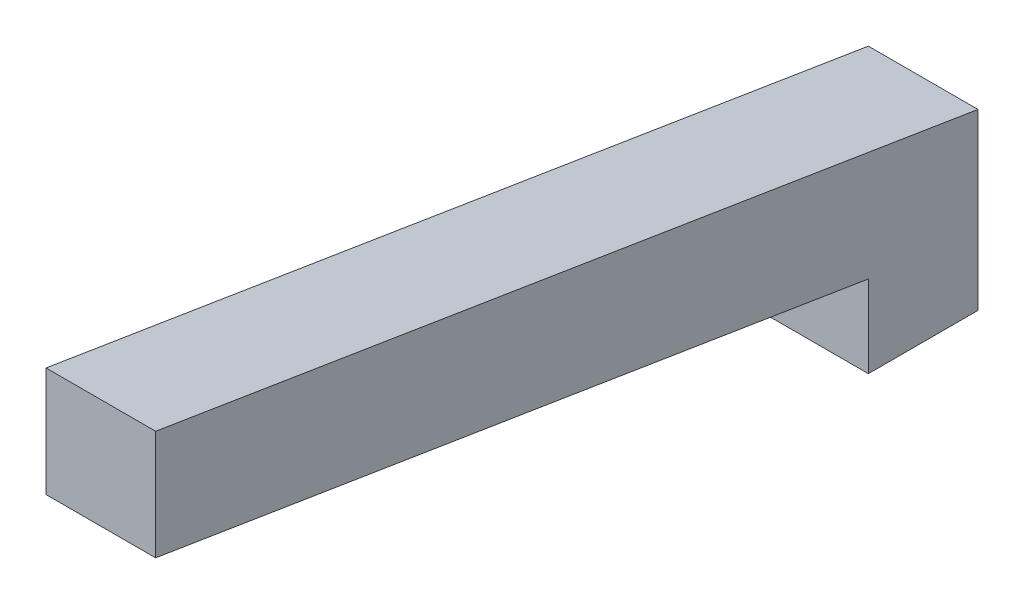
ISO-10303-21;
HEADER;
FILE_DESCRIPTION(('STEP AP214'),'2;1');
FILE_NAME('part.step','',(''),(''),'','','');
FILE_SCHEMA(('AUTOMOTIVE_DESIGN { 1 0 10303 214 1 1 1 1 }'));
ENDSEC;
DATA;
#1=APPLICATION_CONTEXT('core data for automotive mechanical design processes');
#2=APPLICATION_PROTOCOL_DEFINITION('international standard','automotive_design',2000,#1);
#3=PRODUCT_CONTEXT('',#1,'mechanical');
#4=PRODUCT('Part','Part','',(#3));
#5=PRODUCT_RELATED_PRODUCT_CATEGORY('part','',(#4));
#6=PRODUCT_DEFINITION_FORMATION('','',#4);
#7=PRODUCT_DEFINITION_CONTEXT('part definition',#1,'design');
#8=PRODUCT_DEFINITION('design','',#6,#7);
#9=PRODUCT_DEFINITION_SHAPE('','',#8);
#10=(LENGTH_UNIT() NAMED_UNIT(*) SI_UNIT(.MILLI.,.METRE.));
#11=(NAMED_UNIT(*) PLANE_ANGLE_UNIT() SI_UNIT($,.RADIAN.));
#12=(NAMED_UNIT(*) SI_UNIT($,.STERADIAN.) SOLID_ANGLE_UNIT());
#13=UNCERTAINTY_MEASURE_WITH_UNIT(LENGTH_MEASURE(1.E-05),#10,'distance_accuracy_value','');
#14=(GEOMETRIC_REPRESENTATION_CONTEXT(3) GLOBAL_UNCERTAINTY_ASSIGNED_CONTEXT((#13)) GLOBAL_UNIT_ASSIGNED_CONTEXT((#10,
#11,#12)) REPRESENTATION_CONTEXT('',''));
#15=CARTESIAN_POINT('',(0.,0.,0.));
#16=DIRECTION('',(0.,0.,1.));
#17=DIRECTION('',(1.,0.,0.));
#18=AXIS2_PLACEMENT_3D('',#15,#16,#17);
#19=CARTESIAN_POINT('',(5.08,3.80175573671498,0.));
#20=DIRECTION('',(0.,0.,-1.));
#21=DIRECTION('',(0.,1.,0.));
#22=AXIS2_PLACEMENT_3D('',#19,#20,#21);
#23=PLANE('',#22);
#24=DIRECTION('',(0.,-1.,0.));
#25=VECTOR('',#24,1.);
#26=CARTESIAN_POINT('',(0.,3.80175573671498,0.));
#27=LINE('',#26,#25);
#28=CARTESIAN_POINT('',(0.,3.80175573671498,0.));
#29=VERTEX_POINT('',#28);
#30=CARTESIAN_POINT('',(0.,0.,0.));
#31=VERTEX_POINT('',#30);
#32=EDGE_CURVE('E117',#29,#31,#27,.T.);
#33=ORIENTED_EDGE('',*,*,#32,.T.);
#34=DIRECTION('',(-1.,0.,0.));
#35=VECTOR('',#34,1.);
#36=CARTESIAN_POINT('',(5.08,0.,0.));
#37=LINE('',#36,#35);
#38=CARTESIAN_POINT('',(5.08,0.,0.));
#39=VERTEX_POINT('',#38);
#40=EDGE_CURVE('E11',#39,#31,#37,.T.);
#41=ORIENTED_EDGE('',*,*,#40,.F.);
#42=DIRECTION('',(0.,-1.,0.));
#43=VECTOR('',#42,1.);
#44=CARTESIAN_POINT('',(5.08,3.80175573671498,0.));
#45=LINE('',#44,#43);
#46=CARTESIAN_POINT('',(5.08,3.80175573671498,0.));
#47=VERTEX_POINT('',#46);
#48=EDGE_CURVE('E127',#47,#39,#45,.T.);
#49=ORIENTED_EDGE('',*,*,#48,.F.);
#50=DIRECTION('',(-1.,0.,0.));
#51=VECTOR('',#50,1.);
#52=CARTESIAN_POINT('',(5.08,3.80175573671498,0.));
#53=LINE('',#52,#51);
#54=EDGE_CURVE('E113',#47,#29,#53,.T.);
#55=ORIENTED_EDGE('',*,*,#54,.T.);
#56=EDGE_LOOP('',(#33,#41,#49,#55));
#57=FACE_BOUND('',#56,.T.);
#58=ADVANCED_FACE('F33',(#57),#23,.F.);
#59=CARTESIAN_POINT('',(5.08,0.,0.));
#60=DIRECTION('',(0.,1.,0.));
#61=DIRECTION('',(0.,0.,1.));
#62=AXIS2_PLACEMENT_3D('',#59,#60,#61);
#63=PLANE('',#62);
#64=DIRECTION('',(0.,0.,-1.));
#65=VECTOR('',#64,1.);
#66=CARTESIAN_POINT('',(0.,0.,0.));
#67=LINE('',#66,#65);
#68=CARTESIAN_POINT('',(0.,0.,-5.08));
#69=VERTEX_POINT('',#68);
#70=EDGE_CURVE('E120',#31,#69,#67,.T.);
#71=ORIENTED_EDGE('',*,*,#70,.T.);
#72=DIRECTION('',(-1.,0.,0.));
#73=VECTOR('',#72,1.);
#74=CARTESIAN_POINT('',(5.08,0.,-5.08));
#75=LINE('',#74,#73);
#76=CARTESIAN_POINT('',(5.08,0.,-5.08));
#77=VERTEX_POINT('',#76);
#78=EDGE_CURVE('E41',#77,#69,#75,.T.);
#79=ORIENTED_EDGE('',*,*,#78,.F.);
#80=DIRECTION('',(0.,0.,-1.));
#81=VECTOR('',#80,1.);
#82=CARTESIAN_POINT('',(5.08,0.,0.));
#83=LINE('',#82,#81);
#84=EDGE_CURVE('E86',#39,#77,#83,.T.);
#85=ORIENTED_EDGE('',*,*,#84,.F.);
#86=ORIENTED_EDGE('',*,*,#40,.T.);
#87=EDGE_LOOP('',(#71,#79,#85,#86));
#88=FACE_BOUND('',#87,.T.);
#89=ADVANCED_FACE('F151',(#88),#63,.F.);
#90=CARTESIAN_POINT('',(5.08,0.,-5.08));
#91=DIRECTION('',(0.,0.,1.));
#92=DIRECTION('',(1.,0.,0.));
#93=AXIS2_PLACEMENT_3D('',#90,#91,#92);
#94=PLANE('',#93);
#95=DIRECTION('',(0.,1.,0.));
#96=VECTOR('',#95,1.);
#97=CARTESIAN_POINT('',(0.,0.,-5.08));
#98=LINE('',#97,#96);
#99=CARTESIAN_POINT('',(0.,8.06349844225364,-5.08));
#100=VERTEX_POINT('',#99);
#101=EDGE_CURVE('E122',#69,#100,#98,.T.);
#102=ORIENTED_EDGE('',*,*,#101,.T.);
#103=DIRECTION('',(-1.,0.,0.));
#104=VECTOR('',#103,1.);
#105=CARTESIAN_POINT('',(5.08,8.06349844225364,-5.08));
#106=LINE('',#105,#104);
#107=CARTESIAN_POINT('',(5.08,8.06349844225364,-5.08));
#108=VERTEX_POINT('',#107);
#109=EDGE_CURVE('E108',#108,#100,#106,.T.);
#110=ORIENTED_EDGE('',*,*,#109,.F.);
#111=DIRECTION('',(0.,1.,0.));
#112=VECTOR('',#111,1.);
#113=CARTESIAN_POINT('',(5.08,0.,-5.08));
#114=LINE('',#113,#112);
#115=EDGE_CURVE('E99',#77,#108,#114,.T.);
#116=ORIENTED_EDGE('',*,*,#115,.F.);
#117=ORIENTED_EDGE('',*,*,#78,.T.);
#118=EDGE_LOOP('',(#102,#110,#116,#117));
#119=FACE_BOUND('',#118,.T.);
#120=ADVANCED_FACE('F133',(#119),#94,.F.);
#121=CARTESIAN_POINT('',(5.08,8.06349844225364,-5.08));
#122=DIRECTION('',(0.,-0.987274630176988,0.159024540901368));
#123=DIRECTION('',(0.,-0.159024540901368,-0.987274630176988));
#124=AXIS2_PLACEMENT_3D('',#121,#122,#123);
#125=PLANE('',#124);
#126=DIRECTION('',(0.,0.159024540901368,0.987274630176988));
#127=VECTOR('',#126,1.);
#128=CARTESIAN_POINT('',(0.,8.06349844225364,-5.08));
#129=LINE('',#128,#127);
#130=CARTESIAN_POINT('',(0.,14.2004281507138,33.02));
#131=VERTEX_POINT('',#130);
#132=EDGE_CURVE('E107',#100,#131,#129,.T.);
#133=ORIENTED_EDGE('',*,*,#132,.T.);
#134=DIRECTION('',(-1.,0.,0.));
#135=VECTOR('',#134,1.);
#136=CARTESIAN_POINT('',(5.08,14.2004281507138,33.02));
#137=LINE('',#136,#135);
#138=CARTESIAN_POINT('',(5.08,14.2004281507138,33.02));
#139=VERTEX_POINT('',#138);
#140=EDGE_CURVE('E104',#139,#131,#137,.T.);
#141=ORIENTED_EDGE('',*,*,#140,.F.);
#142=DIRECTION('',(0.,0.159024540901368,0.987274630176988));
#143=VECTOR('',#142,1.);
#144=CARTESIAN_POINT('',(5.08,8.06349844225364,-5.08));
#145=LINE('',#144,#143);
#146=EDGE_CURVE('E93',#108,#139,#145,.T.);
#147=ORIENTED_EDGE('',*,*,#146,.F.);
#148=ORIENTED_EDGE('',*,*,#109,.T.);
#149=EDGE_LOOP('',(#133,#141,#147,#148));
#150=FACE_BOUND('',#149,.T.);
#151=ADVANCED_FACE('F105',(#150),#125,.F.);
#152=CARTESIAN_POINT('',(5.08,14.2004281507138,33.02));
#153=DIRECTION('',(0.,0.,-1.));
#154=DIRECTION('',(-1.,0.,0.));
#155=AXIS2_PLACEMENT_3D('',#152,#153,#154);
#156=PLANE('',#155);
#157=DIRECTION('',(0.,-1.,0.));
#158=VECTOR('',#157,1.);
#159=CARTESIAN_POINT('',(0.,14.2004281507138,33.02));
#160=LINE('',#159,#158);
#161=CARTESIAN_POINT('',(0.,9.12042815071376,33.02));
#162=VERTEX_POINT('',#161);
#163=EDGE_CURVE('E72',#131,#162,#160,.T.);
#164=ORIENTED_EDGE('',*,*,#163,.T.);
#165=DIRECTION('',(-1.,0.,0.));
#166=VECTOR('',#165,1.);
#167=CARTESIAN_POINT('',(5.08,9.12042815071376,33.02));
#168=LINE('',#167,#166);
#169=CARTESIAN_POINT('',(5.08,9.12042815071376,33.02));
#170=VERTEX_POINT('',#169);
#171=EDGE_CURVE('E109',#170,#162,#168,.T.);
#172=ORIENTED_EDGE('',*,*,#171,.F.);
#173=DIRECTION('',(0.,-1.,0.));
#174=VECTOR('',#173,1.);
#175=CARTESIAN_POINT('',(5.08,14.2004281507138,33.02));
#176=LINE('',#175,#174);
#177=EDGE_CURVE('E97',#139,#170,#176,.T.);
#178=ORIENTED_EDGE('',*,*,#177,.F.);
#179=ORIENTED_EDGE('',*,*,#140,.T.);
#180=EDGE_LOOP('',(#164,#172,#178,#179));
#181=FACE_BOUND('',#180,.T.);
#182=ADVANCED_FACE('F111',(#181),#156,.F.);
#183=CARTESIAN_POINT('',(5.08,9.12042815071376,33.02));
#184=DIRECTION('',(0.,0.987274630176988,-0.159024540901369));
#185=DIRECTION('',(0.,0.159024540901369,0.987274630176988));
#186=AXIS2_PLACEMENT_3D('',#183,#184,#185);
#187=PLANE('',#186);
#188=DIRECTION('',(0.,-0.159024540901369,-0.987274630176988));
#189=VECTOR('',#188,1.);
#190=CARTESIAN_POINT('',(0.,9.12042815071376,33.02));
#191=LINE('',#190,#189);
#192=EDGE_CURVE('E78',#162,#29,#191,.T.);
#193=ORIENTED_EDGE('',*,*,#192,.T.);
#194=ORIENTED_EDGE('',*,*,#54,.F.);
#195=DIRECTION('',(0.,-0.159024540901369,-0.987274630176988));
#196=VECTOR('',#195,1.);
#197=CARTESIAN_POINT('',(5.08,9.12042815071376,33.02));
#198=LINE('',#197,#196);
#199=EDGE_CURVE('E49',#170,#47,#198,.T.);
#200=ORIENTED_EDGE('',*,*,#199,.F.);
#201=ORIENTED_EDGE('',*,*,#171,.T.);
#202=EDGE_LOOP('',(#193,#194,#200,#201));
#203=FACE_BOUND('',#202,.T.);
#204=ADVANCED_FACE('F140',(#203),#187,.F.);
#205=CARTESIAN_POINT('',(5.08,0.,0.));
#206=DIRECTION('',(1.,0.,0.));
#207=DIRECTION('',(0.,0.,-1.));
#208=AXIS2_PLACEMENT_3D('',#205,#206,#207);
#209=PLANE('',#208);
#210=ORIENTED_EDGE('',*,*,#48,.T.);
#211=ORIENTED_EDGE('',*,*,#84,.T.);
#212=ORIENTED_EDGE('',*,*,#115,.T.);
#213=ORIENTED_EDGE('',*,*,#146,.T.);
#214=ORIENTED_EDGE('',*,*,#177,.T.);
#215=ORIENTED_EDGE('',*,*,#199,.T.);
#216=EDGE_LOOP('',(#210,#211,#212,#213,#214,#215));
#217=FACE_BOUND('',#216,.T.);
#218=ADVANCED_FACE('F95',(#217),#209,.T.);
#219=CARTESIAN_POINT('',(0.,0.,0.));
#220=DIRECTION('',(1.,0.,0.));
#221=DIRECTION('',(0.,0.,-1.));
#222=AXIS2_PLACEMENT_3D('',#219,#220,#221);
#223=PLANE('',#222);
#224=ORIENTED_EDGE('',*,*,#32,.F.);
#225=ORIENTED_EDGE('',*,*,#192,.F.);
#226=ORIENTED_EDGE('',*,*,#163,.F.);
#227=ORIENTED_EDGE('',*,*,#132,.F.);
#228=ORIENTED_EDGE('',*,*,#101,.F.);
#229=ORIENTED_EDGE('',*,*,#70,.F.);
#230=EDGE_LOOP('',(#224,#225,#226,#227,#228,#229));
#231=FACE_BOUND('',#230,.T.);
#232=ADVANCED_FACE('F136',(#231),#223,.F.);
#233=CLOSED_SHELL('',(#58,#89,#120,#151,#182,#204,#218,#232));
#234=MANIFOLD_SOLID_BREP('B2',#233);
#235=ADVANCED_BREP_SHAPE_REPRESENTATION('',(#18,#234),#14);
#236=SHAPE_DEFINITION_REPRESENTATION(#9,#235);
ENDSEC;
END-ISO-10303-21;
